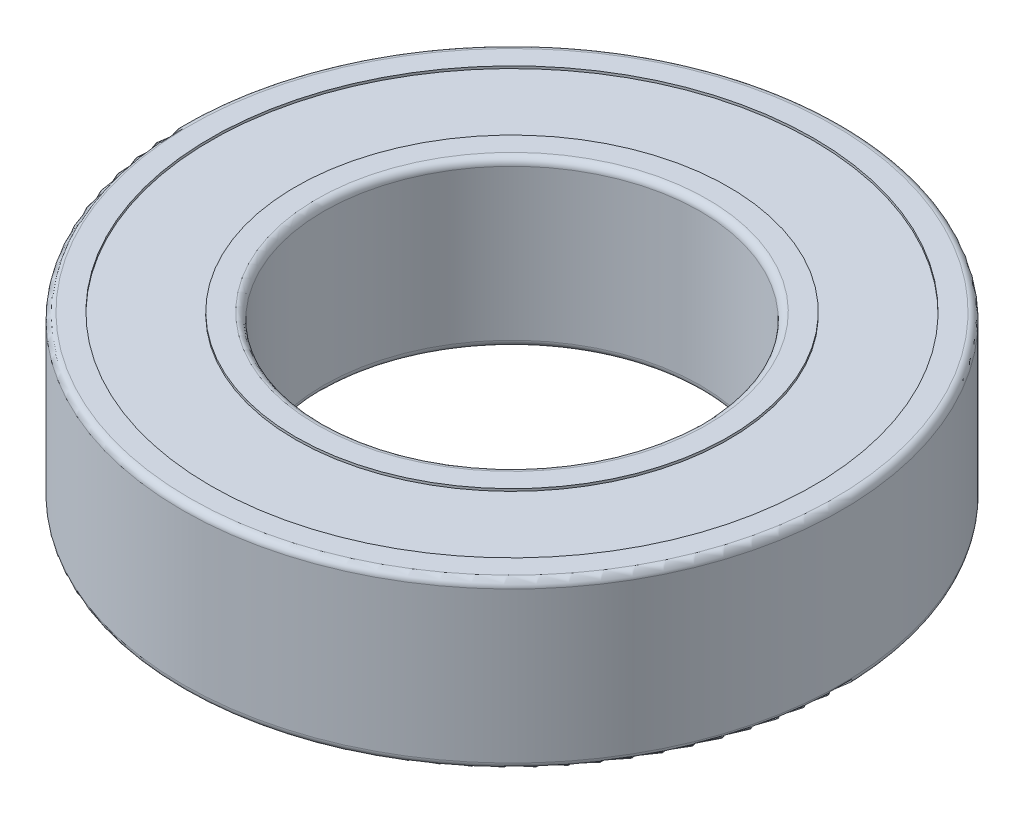
ISO-10303-21;
HEADER;
FILE_DESCRIPTION(('STEP AP214'),'2;1');
FILE_NAME('part.step','',(''),(''),'','','');
FILE_SCHEMA(('AUTOMOTIVE_DESIGN { 1 0 10303 214 1 1 1 1 }'));
ENDSEC;
DATA;
#1=APPLICATION_CONTEXT('core data for automotive mechanical design processes');
#2=APPLICATION_PROTOCOL_DEFINITION('international standard','automotive_design',2000,#1);
#3=PRODUCT_CONTEXT('',#1,'mechanical');
#4=PRODUCT('Part','Part','',(#3));
#5=PRODUCT_RELATED_PRODUCT_CATEGORY('part','',(#4));
#6=PRODUCT_DEFINITION_FORMATION('','',#4);
#7=PRODUCT_DEFINITION_CONTEXT('part definition',#1,'design');
#8=PRODUCT_DEFINITION('design','',#6,#7);
#9=PRODUCT_DEFINITION_SHAPE('','',#8);
#10=(LENGTH_UNIT() NAMED_UNIT(*) SI_UNIT(.MILLI.,.METRE.));
#11=(NAMED_UNIT(*) PLANE_ANGLE_UNIT() SI_UNIT($,.RADIAN.));
#12=(NAMED_UNIT(*) SI_UNIT($,.STERADIAN.) SOLID_ANGLE_UNIT());
#13=UNCERTAINTY_MEASURE_WITH_UNIT(LENGTH_MEASURE(1.E-05),#10,'distance_accuracy_value','');
#14=(GEOMETRIC_REPRESENTATION_CONTEXT(3) GLOBAL_UNCERTAINTY_ASSIGNED_CONTEXT((#13)) GLOBAL_UNIT_ASSIGNED_CONTEXT((#10,
#11,#12)) REPRESENTATION_CONTEXT('',''));
#15=CARTESIAN_POINT('',(0.,0.,0.));
#16=DIRECTION('',(0.,0.,1.));
#17=DIRECTION('',(1.,0.,0.));
#18=AXIS2_PLACEMENT_3D('',#15,#16,#17);
#19=CARTESIAN_POINT('',(0.,0.,0.));
#20=DIRECTION('',(0.,1.,0.));
#21=DIRECTION('',(0.,0.,1.));
#22=AXIS2_PLACEMENT_3D('',#19,#20,#21);
#23=PLANE('',#22);
#24=CARTESIAN_POINT('',(0.,0.,0.));
#25=DIRECTION('',(0.,1.,0.));
#26=DIRECTION('',(0.,0.,1.));
#27=AXIS2_PLACEMENT_3D('',#24,#25,#26);
#28=CIRCLE('',#27,8.3);
#29=CARTESIAN_POINT('',(0.,0.,8.3));
#30=VERTEX_POINT('',#29);
#31=EDGE_CURVE('E57',#30,#30,#28,.T.);
#32=ORIENTED_EDGE('',*,*,#31,.T.);
#33=EDGE_LOOP('',(#32));
#34=FACE_BOUND('',#33,.T.);
#35=CARTESIAN_POINT('',(0.,0.,0.));
#36=DIRECTION('',(0.,1.,0.));
#37=DIRECTION('',(0.,0.,1.));
#38=AXIS2_PLACEMENT_3D('',#35,#36,#37);
#39=CIRCLE('',#38,9.2);
#40=CARTESIAN_POINT('',(0.,0.,9.2));
#41=VERTEX_POINT('',#40);
#42=EDGE_CURVE('E88',#41,#41,#39,.T.);
#43=ORIENTED_EDGE('',*,*,#42,.F.);
#44=EDGE_LOOP('',(#43));
#45=FACE_BOUND('',#44,.T.);
#46=ADVANCED_FACE('F37',(#34,#45),#23,.F.);
#47=CARTESIAN_POINT('',(0.,7.,0.));
#48=DIRECTION('',(0.,1.,0.));
#49=DIRECTION('',(0.,0.,1.));
#50=AXIS2_PLACEMENT_3D('',#47,#48,#49);
#51=PLANE('',#50);
#52=CARTESIAN_POINT('',(0.,7.,0.));
#53=DIRECTION('',(0.,1.,0.));
#54=DIRECTION('',(0.,0.,1.));
#55=AXIS2_PLACEMENT_3D('',#52,#53,#54);
#56=CIRCLE('',#55,8.3);
#57=CARTESIAN_POINT('',(0.,7.,8.3));
#58=VERTEX_POINT('',#57);
#59=EDGE_CURVE('E60',#58,#58,#56,.F.);
#60=ORIENTED_EDGE('',*,*,#59,.T.);
#61=EDGE_LOOP('',(#60));
#62=FACE_BOUND('',#61,.T.);
#63=CARTESIAN_POINT('',(0.,7.,0.));
#64=DIRECTION('',(0.,1.,0.));
#65=DIRECTION('',(0.,0.,1.));
#66=AXIS2_PLACEMENT_3D('',#63,#64,#65);
#67=CIRCLE('',#66,9.2);
#68=CARTESIAN_POINT('',(0.,7.,9.2));
#69=VERTEX_POINT('',#68);
#70=EDGE_CURVE('E76',#69,#69,#67,.T.);
#71=ORIENTED_EDGE('',*,*,#70,.T.);
#72=EDGE_LOOP('',(#71));
#73=FACE_BOUND('',#72,.T.);
#74=ADVANCED_FACE('F105',(#62,#73),#51,.T.);
#75=CARTESIAN_POINT('',(0.,7.,0.));
#76=DIRECTION('',(0.,1.,0.));
#77=DIRECTION('',(0.,0.,1.));
#78=AXIS2_PLACEMENT_3D('',#75,#76,#77);
#79=CIRCLE('',#78,13.7);
#80=CARTESIAN_POINT('',(0.,7.,13.7));
#81=VERTEX_POINT('',#80);
#82=EDGE_CURVE('E10',#81,#81,#79,.T.);
#83=ORIENTED_EDGE('',*,*,#82,.T.);
#84=EDGE_LOOP('',(#83));
#85=FACE_BOUND('',#84,.T.);
#86=CARTESIAN_POINT('',(0.,7.,0.));
#87=DIRECTION('',(0.,1.,0.));
#88=DIRECTION('',(0.,0.,1.));
#89=AXIS2_PLACEMENT_3D('',#86,#87,#88);
#90=CIRCLE('',#89,12.8);
#91=CARTESIAN_POINT('',(0.,7.,12.8));
#92=VERTEX_POINT('',#91);
#93=EDGE_CURVE('E70',#92,#92,#90,.T.);
#94=ORIENTED_EDGE('',*,*,#93,.F.);
#95=EDGE_LOOP('',(#94));
#96=FACE_BOUND('',#95,.T.);
#97=ADVANCED_FACE('F112',(#85,#96),#51,.T.);
#98=CARTESIAN_POINT('',(0.,0.,0.));
#99=DIRECTION('',(0.,1.,0.));
#100=DIRECTION('',(0.,0.,1.));
#101=AXIS2_PLACEMENT_3D('',#98,#99,#100);
#102=CIRCLE('',#101,13.7);
#103=CARTESIAN_POINT('',(0.,0.,13.7));
#104=VERTEX_POINT('',#103);
#105=EDGE_CURVE('E44',#104,#104,#102,.F.);
#106=ORIENTED_EDGE('',*,*,#105,.T.);
#107=EDGE_LOOP('',(#106));
#108=FACE_BOUND('',#107,.T.);
#109=CARTESIAN_POINT('',(0.,0.,0.));
#110=DIRECTION('',(0.,1.,0.));
#111=DIRECTION('',(0.,0.,1.));
#112=AXIS2_PLACEMENT_3D('',#109,#110,#111);
#113=CIRCLE('',#112,12.8);
#114=CARTESIAN_POINT('',(0.,0.,12.8));
#115=VERTEX_POINT('',#114);
#116=EDGE_CURVE('E82',#115,#115,#113,.T.);
#117=ORIENTED_EDGE('',*,*,#116,.T.);
#118=EDGE_LOOP('',(#117));
#119=FACE_BOUND('',#118,.T.);
#120=ADVANCED_FACE('F108',(#108,#119),#23,.F.);
#121=CARTESIAN_POINT('',(0.,7.,0.));
#122=DIRECTION('',(0.,-1.,0.));
#123=DIRECTION('',(0.,0.,-1.));
#124=AXIS2_PLACEMENT_3D('',#121,#122,#123);
#125=CYLINDRICAL_SURFACE('',#124,14.);
#126=CARTESIAN_POINT('',(0.,0.3,0.));
#127=DIRECTION('',(0.,1.,0.));
#128=DIRECTION('',(0.,0.,1.));
#129=AXIS2_PLACEMENT_3D('',#126,#127,#128);
#130=CIRCLE('',#129,14.);
#131=CARTESIAN_POINT('',(0.,0.3,14.));
#132=VERTEX_POINT('',#131);
#133=EDGE_CURVE('E48',#132,#132,#130,.T.);
#134=ORIENTED_EDGE('',*,*,#133,.T.);
#135=EDGE_LOOP('',(#134));
#136=FACE_BOUND('',#135,.T.);
#137=CARTESIAN_POINT('',(0.,6.7,0.));
#138=DIRECTION('',(0.,1.,0.));
#139=DIRECTION('',(0.,0.,1.));
#140=AXIS2_PLACEMENT_3D('',#137,#138,#139);
#141=CIRCLE('',#140,14.);
#142=CARTESIAN_POINT('',(0.,6.7,14.));
#143=VERTEX_POINT('',#142);
#144=EDGE_CURVE('E52',#143,#143,#141,.F.);
#145=ORIENTED_EDGE('',*,*,#144,.T.);
#146=EDGE_LOOP('',(#145));
#147=FACE_BOUND('',#146,.T.);
#148=ADVANCED_FACE('F117',(#136,#147),#125,.T.);
#149=CARTESIAN_POINT('',(0.,7.,0.));
#150=DIRECTION('',(0.,-1.,0.));
#151=DIRECTION('',(0.,0.,-1.));
#152=AXIS2_PLACEMENT_3D('',#149,#150,#151);
#153=CYLINDRICAL_SURFACE('',#152,8.);
#154=CARTESIAN_POINT('',(0.,6.7,0.));
#155=DIRECTION('',(0.,1.,0.));
#156=DIRECTION('',(0.,0.,1.));
#157=AXIS2_PLACEMENT_3D('',#154,#155,#156);
#158=CIRCLE('',#157,8.);
#159=CARTESIAN_POINT('',(0.,6.7,8.));
#160=VERTEX_POINT('',#159);
#161=EDGE_CURVE('E63',#160,#160,#158,.T.);
#162=ORIENTED_EDGE('',*,*,#161,.T.);
#163=EDGE_LOOP('',(#162));
#164=FACE_BOUND('',#163,.T.);
#165=CARTESIAN_POINT('',(0.,0.3,0.));
#166=DIRECTION('',(0.,1.,0.));
#167=DIRECTION('',(0.,0.,1.));
#168=AXIS2_PLACEMENT_3D('',#165,#166,#167);
#169=CIRCLE('',#168,8.);
#170=CARTESIAN_POINT('',(0.,0.3,8.));
#171=VERTEX_POINT('',#170);
#172=EDGE_CURVE('E66',#171,#171,#169,.F.);
#173=ORIENTED_EDGE('',*,*,#172,.T.);
#174=EDGE_LOOP('',(#173));
#175=FACE_BOUND('',#174,.T.);
#176=ADVANCED_FACE('F122',(#164,#175),#153,.F.);
#177=CARTESIAN_POINT('',(0.,6.9,0.));
#178=DIRECTION('',(0.,1.,0.));
#179=DIRECTION('',(0.,0.,1.));
#180=AXIS2_PLACEMENT_3D('',#177,#178,#179);
#181=CYLINDRICAL_SURFACE('',#180,12.8);
#182=CARTESIAN_POINT('',(0.,6.9,0.));
#183=DIRECTION('',(0.,1.,0.));
#184=DIRECTION('',(0.,0.,1.));
#185=AXIS2_PLACEMENT_3D('',#182,#183,#184);
#186=CIRCLE('',#185,12.8);
#187=CARTESIAN_POINT('',(0.,6.9,12.8));
#188=VERTEX_POINT('',#187);
#189=EDGE_CURVE('E69',#188,#188,#186,.T.);
#190=ORIENTED_EDGE('',*,*,#189,.F.);
#191=EDGE_LOOP('',(#190));
#192=FACE_BOUND('',#191,.T.);
#193=ORIENTED_EDGE('',*,*,#93,.T.);
#194=EDGE_LOOP('',(#193));
#195=FACE_BOUND('',#194,.T.);
#196=ADVANCED_FACE('F143',(#192,#195),#181,.F.);
#197=CARTESIAN_POINT('',(0.,6.9,0.));
#198=DIRECTION('',(0.,1.,0.));
#199=DIRECTION('',(0.,0.,1.));
#200=AXIS2_PLACEMENT_3D('',#197,#198,#199);
#201=PLANE('',#200);
#202=CARTESIAN_POINT('',(0.,6.9,0.));
#203=DIRECTION('',(0.,1.,0.));
#204=DIRECTION('',(0.,0.,1.));
#205=AXIS2_PLACEMENT_3D('',#202,#203,#204);
#206=CIRCLE('',#205,9.2);
#207=CARTESIAN_POINT('',(0.,6.9,9.2));
#208=VERTEX_POINT('',#207);
#209=EDGE_CURVE('E73',#208,#208,#206,.T.);
#210=ORIENTED_EDGE('',*,*,#209,.F.);
#211=EDGE_LOOP('',(#210));
#212=FACE_BOUND('',#211,.T.);
#213=ORIENTED_EDGE('',*,*,#189,.T.);
#214=EDGE_LOOP('',(#213));
#215=FACE_BOUND('',#214,.T.);
#216=ADVANCED_FACE('F139',(#212,#215),#201,.T.);
#217=CARTESIAN_POINT('',(0.,6.9,0.));
#218=DIRECTION('',(0.,1.,0.));
#219=DIRECTION('',(0.,0.,1.));
#220=AXIS2_PLACEMENT_3D('',#217,#218,#219);
#221=CYLINDRICAL_SURFACE('',#220,9.2);
#222=ORIENTED_EDGE('',*,*,#209,.T.);
#223=EDGE_LOOP('',(#222));
#224=FACE_BOUND('',#223,.T.);
#225=ORIENTED_EDGE('',*,*,#70,.F.);
#226=EDGE_LOOP('',(#225));
#227=FACE_BOUND('',#226,.T.);
#228=ADVANCED_FACE('F133',(#224,#227),#221,.T.);
#229=CARTESIAN_POINT('',(0.,0.1,0.));
#230=DIRECTION('',(0.,-1.,0.));
#231=DIRECTION('',(0.,0.,1.));
#232=AXIS2_PLACEMENT_3D('',#229,#230,#231);
#233=PLANE('',#232);
#234=CARTESIAN_POINT('',(0.,0.1,0.));
#235=DIRECTION('',(0.,1.,0.));
#236=DIRECTION('',(0.,0.,1.));
#237=AXIS2_PLACEMENT_3D('',#234,#235,#236);
#238=CIRCLE('',#237,12.8);
#239=CARTESIAN_POINT('',(0.,0.1,12.8));
#240=VERTEX_POINT('',#239);
#241=EDGE_CURVE('E79',#240,#240,#238,.T.);
#242=ORIENTED_EDGE('',*,*,#241,.F.);
#243=EDGE_LOOP('',(#242));
#244=FACE_BOUND('',#243,.T.);
#245=CARTESIAN_POINT('',(0.,0.1,0.));
#246=DIRECTION('',(0.,1.,0.));
#247=DIRECTION('',(0.,0.,1.));
#248=AXIS2_PLACEMENT_3D('',#245,#246,#247);
#249=CIRCLE('',#248,9.2);
#250=CARTESIAN_POINT('',(0.,0.1,9.2));
#251=VERTEX_POINT('',#250);
#252=EDGE_CURVE('E85',#251,#251,#249,.T.);
#253=ORIENTED_EDGE('',*,*,#252,.T.);
#254=EDGE_LOOP('',(#253));
#255=FACE_BOUND('',#254,.T.);
#256=ADVANCED_FACE('F94',(#244,#255),#233,.T.);
#257=CARTESIAN_POINT('',(0.,0.1,0.));
#258=DIRECTION('',(0.,-1.,0.));
#259=DIRECTION('',(0.,0.,-1.));
#260=AXIS2_PLACEMENT_3D('',#257,#258,#259);
#261=CYLINDRICAL_SURFACE('',#260,12.8);
#262=ORIENTED_EDGE('',*,*,#241,.T.);
#263=EDGE_LOOP('',(#262));
#264=FACE_BOUND('',#263,.T.);
#265=ORIENTED_EDGE('',*,*,#116,.F.);
#266=EDGE_LOOP('',(#265));
#267=FACE_BOUND('',#266,.T.);
#268=ADVANCED_FACE('F100',(#264,#267),#261,.F.);
#269=CARTESIAN_POINT('',(0.,0.1,0.));
#270=DIRECTION('',(0.,-1.,0.));
#271=DIRECTION('',(0.,0.,-1.));
#272=AXIS2_PLACEMENT_3D('',#269,#270,#271);
#273=CYLINDRICAL_SURFACE('',#272,9.2);
#274=ORIENTED_EDGE('',*,*,#252,.F.);
#275=EDGE_LOOP('',(#274));
#276=FACE_BOUND('',#275,.T.);
#277=ORIENTED_EDGE('',*,*,#42,.T.);
#278=EDGE_LOOP('',(#277));
#279=FACE_BOUND('',#278,.T.);
#280=ADVANCED_FACE('F96',(#276,#279),#273,.T.);
#281=CARTESIAN_POINT('',(0.,6.7,0.));
#282=DIRECTION('',(0.,1.,0.));
#283=DIRECTION('',(0.,0.,1.));
#284=AXIS2_PLACEMENT_3D('',#281,#282,#283);
#285=TOROIDAL_SURFACE('',#284,8.3,0.3);
#286=ORIENTED_EDGE('',*,*,#59,.F.);
#287=EDGE_LOOP('',(#286));
#288=FACE_BOUND('',#287,.T.);
#289=ORIENTED_EDGE('',*,*,#161,.F.);
#290=EDGE_LOOP('',(#289));
#291=FACE_BOUND('',#290,.T.);
#292=ADVANCED_FACE('F99',(#288,#291),#285,.T.);
#293=CARTESIAN_POINT('',(0.,0.3,0.));
#294=DIRECTION('',(0.,1.,0.));
#295=DIRECTION('',(0.,0.,1.));
#296=AXIS2_PLACEMENT_3D('',#293,#294,#295);
#297=TOROIDAL_SURFACE('',#296,8.3,0.3);
#298=ORIENTED_EDGE('',*,*,#172,.F.);
#299=EDGE_LOOP('',(#298));
#300=FACE_BOUND('',#299,.T.);
#301=ORIENTED_EDGE('',*,*,#31,.F.);
#302=EDGE_LOOP('',(#301));
#303=FACE_BOUND('',#302,.T.);
#304=ADVANCED_FACE('F156',(#300,#303),#297,.T.);
#305=CARTESIAN_POINT('',(0.,0.3,0.));
#306=DIRECTION('',(0.,1.,0.));
#307=DIRECTION('',(0.,0.,1.));
#308=AXIS2_PLACEMENT_3D('',#305,#306,#307);
#309=TOROIDAL_SURFACE('',#308,13.7,0.3);
#310=ORIENTED_EDGE('',*,*,#105,.F.);
#311=EDGE_LOOP('',(#310));
#312=FACE_BOUND('',#311,.T.);
#313=ORIENTED_EDGE('',*,*,#133,.F.);
#314=EDGE_LOOP('',(#313));
#315=FACE_BOUND('',#314,.T.);
#316=ADVANCED_FACE('F159',(#312,#315),#309,.T.);
#317=CARTESIAN_POINT('',(0.,6.7,0.));
#318=DIRECTION('',(0.,1.,0.));
#319=DIRECTION('',(0.,0.,1.));
#320=AXIS2_PLACEMENT_3D('',#317,#318,#319);
#321=TOROIDAL_SURFACE('',#320,13.7,0.3);
#322=ORIENTED_EDGE('',*,*,#144,.F.);
#323=EDGE_LOOP('',(#322));
#324=FACE_BOUND('',#323,.T.);
#325=ORIENTED_EDGE('',*,*,#82,.F.);
#326=EDGE_LOOP('',(#325));
#327=FACE_BOUND('',#326,.T.);
#328=ADVANCED_FACE('F39',(#324,#327),#321,.T.);
#329=CLOSED_SHELL('',(#46,#74,#97,#120,#148,#176,#196,#216,#228,#256,#268,#280,#292,#304,#316,#328));
#330=MANIFOLD_SOLID_BREP('B2',#329);
#331=ADVANCED_BREP_SHAPE_REPRESENTATION('',(#18,#330),#14);
#332=SHAPE_DEFINITION_REPRESENTATION(#9,#331);
ENDSEC;
END-ISO-10303-21;
